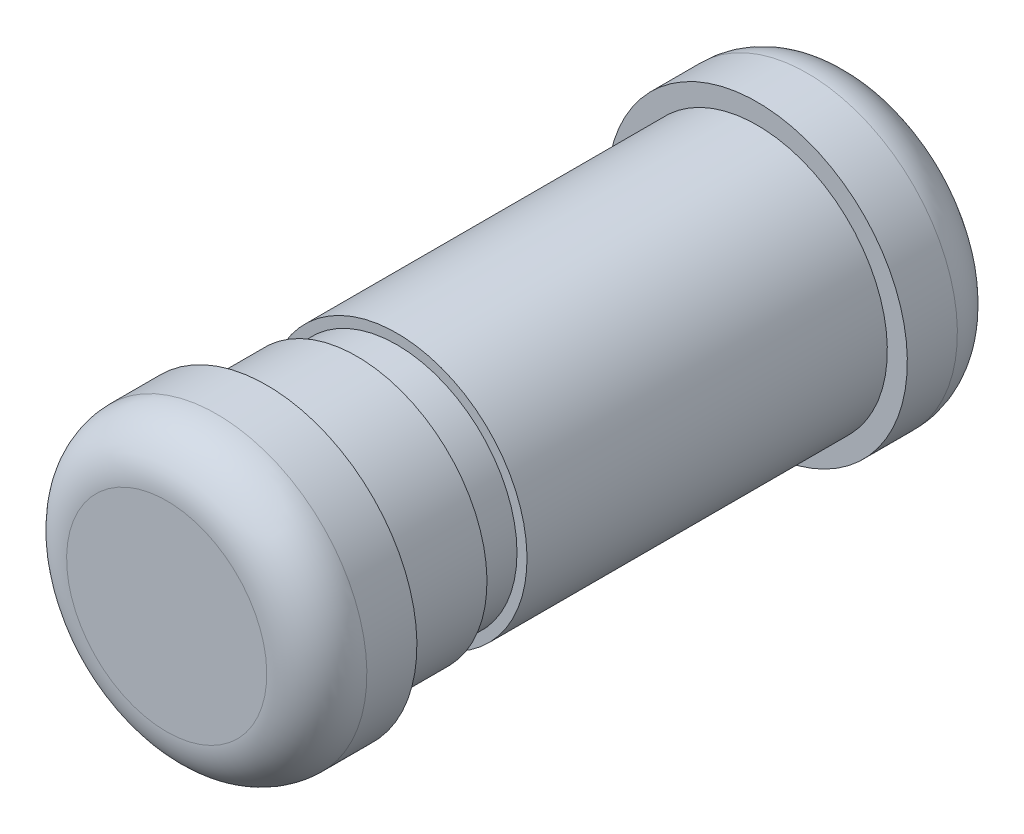
ISO-10303-21;
HEADER;
FILE_DESCRIPTION(('STEP AP214'),'2;1');
FILE_NAME('part.step','',(''),(''),'','','');
FILE_SCHEMA(('AUTOMOTIVE_DESIGN { 1 0 10303 214 1 1 1 1 }'));
ENDSEC;
DATA;
#1=APPLICATION_CONTEXT('core data for automotive mechanical design processes');
#2=APPLICATION_PROTOCOL_DEFINITION('international standard','automotive_design',2000,#1);
#3=PRODUCT_CONTEXT('',#1,'mechanical');
#4=PRODUCT('Part','Part','',(#3));
#5=PRODUCT_RELATED_PRODUCT_CATEGORY('part','',(#4));
#6=PRODUCT_DEFINITION_FORMATION('','',#4);
#7=PRODUCT_DEFINITION_CONTEXT('part definition',#1,'design');
#8=PRODUCT_DEFINITION('design','',#6,#7);
#9=PRODUCT_DEFINITION_SHAPE('','',#8);
#10=(LENGTH_UNIT() NAMED_UNIT(*) SI_UNIT(.MILLI.,.METRE.));
#11=(NAMED_UNIT(*) PLANE_ANGLE_UNIT() SI_UNIT($,.RADIAN.));
#12=(NAMED_UNIT(*) SI_UNIT($,.STERADIAN.) SOLID_ANGLE_UNIT());
#13=UNCERTAINTY_MEASURE_WITH_UNIT(LENGTH_MEASURE(1.E-05),#10,'distance_accuracy_value','');
#14=(GEOMETRIC_REPRESENTATION_CONTEXT(3) GLOBAL_UNCERTAINTY_ASSIGNED_CONTEXT((#13)) GLOBAL_UNIT_ASSIGNED_CONTEXT((#10,
#11,#12)) REPRESENTATION_CONTEXT('',''));
#15=CARTESIAN_POINT('',(0.,0.,0.));
#16=DIRECTION('',(0.,0.,1.));
#17=DIRECTION('',(1.,0.,0.));
#18=AXIS2_PLACEMENT_3D('',#15,#16,#17);
#19=CARTESIAN_POINT('',(0.,-0.499999999999998,-1.725));
#20=DIRECTION('',(0.,0.,-1.));
#21=DIRECTION('',(0.,1.,0.));
#22=AXIS2_PLACEMENT_3D('',#19,#20,#21);
#23=PLANE('',#22);
#24=CARTESIAN_POINT('',(0.,0.,-1.725));
#25=DIRECTION('',(0.,0.,1.));
#26=DIRECTION('',(0.,-1.,0.));
#27=AXIS2_PLACEMENT_3D('',#24,#25,#26);
#28=CIRCLE('',#27,0.499999999999999);
#29=CARTESIAN_POINT('',(0.,-0.499999999999998,-1.725));
#30=VERTEX_POINT('',#29);
#31=EDGE_CURVE('E10',#30,#30,#28,.T.);
#32=ORIENTED_EDGE('',*,*,#31,.F.);
#33=EDGE_LOOP('',(#32));
#34=FACE_BOUND('',#33,.T.);
#35=ADVANCED_FACE('F41',(#34),#23,.T.);
#36=CARTESIAN_POINT('',(0.,0.,-1.475));
#37=DIRECTION('',(0.,0.,1.));
#38=DIRECTION('',(0.,-1.,0.));
#39=AXIS2_PLACEMENT_3D('',#36,#37,#38);
#40=TOROIDAL_SURFACE('',#39,0.500000000000001,0.25);
#41=ORIENTED_EDGE('',*,*,#31,.T.);
#42=EDGE_LOOP('',(#41));
#43=FACE_BOUND('',#42,.T.);
#44=CARTESIAN_POINT('',(0.,0.,-1.475));
#45=DIRECTION('',(0.,0.,1.));
#46=DIRECTION('',(0.,-1.,0.));
#47=AXIS2_PLACEMENT_3D('',#44,#45,#46);
#48=CIRCLE('',#47,0.750000000000001);
#49=CARTESIAN_POINT('',(0.,-0.75,-1.475));
#50=VERTEX_POINT('',#49);
#51=EDGE_CURVE('E48',#50,#50,#48,.T.);
#52=ORIENTED_EDGE('',*,*,#51,.F.);
#53=EDGE_LOOP('',(#52));
#54=FACE_BOUND('',#53,.T.);
#55=ADVANCED_FACE('F113',(#43,#54),#40,.T.);
#56=CARTESIAN_POINT('',(0.,0.,1.725));
#57=DIRECTION('',(0.,0.,1.));
#58=DIRECTION('',(0.,-1.,0.));
#59=AXIS2_PLACEMENT_3D('',#56,#57,#58);
#60=CYLINDRICAL_SURFACE('',#59,0.750000000000001);
#61=ORIENTED_EDGE('',*,*,#51,.T.);
#62=EDGE_LOOP('',(#61));
#63=FACE_BOUND('',#62,.T.);
#64=CARTESIAN_POINT('',(0.,0.,-1.225));
#65=DIRECTION('',(0.,0.,1.));
#66=DIRECTION('',(0.,-1.,0.));
#67=AXIS2_PLACEMENT_3D('',#64,#65,#66);
#68=CIRCLE('',#67,0.750000000000001);
#69=CARTESIAN_POINT('',(0.,-0.75,-1.225));
#70=VERTEX_POINT('',#69);
#71=EDGE_CURVE('E54',#70,#70,#68,.T.);
#72=ORIENTED_EDGE('',*,*,#71,.F.);
#73=EDGE_LOOP('',(#72));
#74=FACE_BOUND('',#73,.T.);
#75=ADVANCED_FACE('F118',(#63,#74),#60,.T.);
#76=CARTESIAN_POINT('',(0.,-0.75,-1.225));
#77=DIRECTION('',(0.,0.,1.));
#78=DIRECTION('',(0.,-1.,0.));
#79=AXIS2_PLACEMENT_3D('',#76,#77,#78);
#80=PLANE('',#79);
#81=ORIENTED_EDGE('',*,*,#71,.T.);
#82=EDGE_LOOP('',(#81));
#83=FACE_BOUND('',#82,.T.);
#84=CARTESIAN_POINT('',(0.,0.,-1.225));
#85=DIRECTION('',(0.,0.,1.));
#86=DIRECTION('',(0.,-1.,0.));
#87=AXIS2_PLACEMENT_3D('',#84,#85,#86);
#88=CIRCLE('',#87,0.65);
#89=CARTESIAN_POINT('',(0.,-0.65,-1.225));
#90=VERTEX_POINT('',#89);
#91=EDGE_CURVE('E60',#90,#90,#88,.T.);
#92=ORIENTED_EDGE('',*,*,#91,.F.);
#93=EDGE_LOOP('',(#92));
#94=FACE_BOUND('',#93,.T.);
#95=ADVANCED_FACE('F122',(#83,#94),#80,.T.);
#96=CARTESIAN_POINT('',(0.,0.,1.725));
#97=DIRECTION('',(0.,0.,1.));
#98=DIRECTION('',(0.,-1.,0.));
#99=AXIS2_PLACEMENT_3D('',#96,#97,#98);
#100=CYLINDRICAL_SURFACE('',#99,0.65);
#101=ORIENTED_EDGE('',*,*,#91,.T.);
#102=EDGE_LOOP('',(#101));
#103=FACE_BOUND('',#102,.T.);
#104=CARTESIAN_POINT('',(0.,0.,0.575));
#105=DIRECTION('',(0.,0.,1.));
#106=DIRECTION('',(0.,-1.,0.));
#107=AXIS2_PLACEMENT_3D('',#104,#105,#106);
#108=CIRCLE('',#107,0.65);
#109=CARTESIAN_POINT('',(0.,-0.65,0.575));
#110=VERTEX_POINT('',#109);
#111=EDGE_CURVE('E66',#110,#110,#108,.T.);
#112=ORIENTED_EDGE('',*,*,#111,.F.);
#113=EDGE_LOOP('',(#112));
#114=FACE_BOUND('',#113,.T.);
#115=ADVANCED_FACE('F128',(#103,#114),#100,.T.);
#116=CARTESIAN_POINT('',(0.,-0.65,0.575));
#117=DIRECTION('',(0.,0.,1.));
#118=DIRECTION('',(0.,-1.,0.));
#119=AXIS2_PLACEMENT_3D('',#116,#117,#118);
#120=PLANE('',#119);
#121=ORIENTED_EDGE('',*,*,#111,.T.);
#122=EDGE_LOOP('',(#121));
#123=FACE_BOUND('',#122,.T.);
#124=CARTESIAN_POINT('',(0.,0.,0.575));
#125=DIRECTION('',(0.,0.,1.));
#126=DIRECTION('',(0.,-1.,0.));
#127=AXIS2_PLACEMENT_3D('',#124,#125,#126);
#128=CIRCLE('',#127,0.6);
#129=CARTESIAN_POINT('',(0.,-0.6,0.575));
#130=VERTEX_POINT('',#129);
#131=EDGE_CURVE('E70',#130,#130,#128,.T.);
#132=ORIENTED_EDGE('',*,*,#131,.F.);
#133=EDGE_LOOP('',(#132));
#134=FACE_BOUND('',#133,.T.);
#135=ADVANCED_FACE('F132',(#123,#134),#120,.T.);
#136=CARTESIAN_POINT('',(0.,0.,1.725));
#137=DIRECTION('',(0.,0.,1.));
#138=DIRECTION('',(0.,-1.,0.));
#139=AXIS2_PLACEMENT_3D('',#136,#137,#138);
#140=CYLINDRICAL_SURFACE('',#139,0.6);
#141=ORIENTED_EDGE('',*,*,#131,.T.);
#142=EDGE_LOOP('',(#141));
#143=FACE_BOUND('',#142,.T.);
#144=CARTESIAN_POINT('',(0.,0.,0.775));
#145=DIRECTION('',(0.,0.,1.));
#146=DIRECTION('',(0.,-1.,0.));
#147=AXIS2_PLACEMENT_3D('',#144,#145,#146);
#148=CIRCLE('',#147,0.6);
#149=CARTESIAN_POINT('',(0.,-0.6,0.775));
#150=VERTEX_POINT('',#149);
#151=EDGE_CURVE('E73',#150,#150,#148,.T.);
#152=ORIENTED_EDGE('',*,*,#151,.F.);
#153=EDGE_LOOP('',(#152));
#154=FACE_BOUND('',#153,.T.);
#155=ADVANCED_FACE('F136',(#143,#154),#140,.T.);
#156=CARTESIAN_POINT('',(0.,-0.6,0.775));
#157=DIRECTION('',(0.,0.,-1.));
#158=DIRECTION('',(0.,1.,0.));
#159=AXIS2_PLACEMENT_3D('',#156,#157,#158);
#160=PLANE('',#159);
#161=ORIENTED_EDGE('',*,*,#151,.T.);
#162=EDGE_LOOP('',(#161));
#163=FACE_BOUND('',#162,.T.);
#164=CARTESIAN_POINT('',(0.,0.,0.775));
#165=DIRECTION('',(0.,0.,1.));
#166=DIRECTION('',(0.,-1.,0.));
#167=AXIS2_PLACEMENT_3D('',#164,#165,#166);
#168=CIRCLE('',#167,0.65);
#169=CARTESIAN_POINT('',(0.,-0.65,0.775));
#170=VERTEX_POINT('',#169);
#171=EDGE_CURVE('E77',#170,#170,#168,.T.);
#172=ORIENTED_EDGE('',*,*,#171,.F.);
#173=EDGE_LOOP('',(#172));
#174=FACE_BOUND('',#173,.T.);
#175=ADVANCED_FACE('F140',(#163,#174),#160,.T.);
#176=CARTESIAN_POINT('',(0.,0.,1.725));
#177=DIRECTION('',(0.,0.,1.));
#178=DIRECTION('',(0.,-1.,0.));
#179=AXIS2_PLACEMENT_3D('',#176,#177,#178);
#180=CYLINDRICAL_SURFACE('',#179,0.65);
#181=ORIENTED_EDGE('',*,*,#171,.T.);
#182=EDGE_LOOP('',(#181));
#183=FACE_BOUND('',#182,.T.);
#184=CARTESIAN_POINT('',(0.,0.,1.225));
#185=DIRECTION('',(0.,0.,1.));
#186=DIRECTION('',(0.,-1.,0.));
#187=AXIS2_PLACEMENT_3D('',#184,#185,#186);
#188=CIRCLE('',#187,0.65);
#189=CARTESIAN_POINT('',(0.,-0.65,1.225));
#190=VERTEX_POINT('',#189);
#191=EDGE_CURVE('E81',#190,#190,#188,.T.);
#192=ORIENTED_EDGE('',*,*,#191,.F.);
#193=EDGE_LOOP('',(#192));
#194=FACE_BOUND('',#193,.T.);
#195=ADVANCED_FACE('F144',(#183,#194),#180,.T.);
#196=CARTESIAN_POINT('',(0.,-0.75,1.225));
#197=DIRECTION('',(0.,0.,-1.));
#198=DIRECTION('',(0.,1.,0.));
#199=AXIS2_PLACEMENT_3D('',#196,#197,#198);
#200=PLANE('',#199);
#201=ORIENTED_EDGE('',*,*,#191,.T.);
#202=EDGE_LOOP('',(#201));
#203=FACE_BOUND('',#202,.T.);
#204=CARTESIAN_POINT('',(0.,0.,1.225));
#205=DIRECTION('',(0.,0.,1.));
#206=DIRECTION('',(0.,-1.,0.));
#207=AXIS2_PLACEMENT_3D('',#204,#205,#206);
#208=CIRCLE('',#207,0.75);
#209=CARTESIAN_POINT('',(0.,-0.75,1.225));
#210=VERTEX_POINT('',#209);
#211=EDGE_CURVE('E84',#210,#210,#208,.T.);
#212=ORIENTED_EDGE('',*,*,#211,.F.);
#213=EDGE_LOOP('',(#212));
#214=FACE_BOUND('',#213,.T.);
#215=ADVANCED_FACE('F109',(#203,#214),#200,.T.);
#216=CARTESIAN_POINT('',(0.,0.,1.725));
#217=DIRECTION('',(0.,0.,1.));
#218=DIRECTION('',(0.,-1.,0.));
#219=AXIS2_PLACEMENT_3D('',#216,#217,#218);
#220=CYLINDRICAL_SURFACE('',#219,0.75);
#221=ORIENTED_EDGE('',*,*,#211,.T.);
#222=EDGE_LOOP('',(#221));
#223=FACE_BOUND('',#222,.T.);
#224=CARTESIAN_POINT('',(0.,0.,1.475));
#225=DIRECTION('',(0.,0.,1.));
#226=DIRECTION('',(0.,-1.,0.));
#227=AXIS2_PLACEMENT_3D('',#224,#225,#226);
#228=CIRCLE('',#227,0.75);
#229=CARTESIAN_POINT('',(0.,-0.75,1.475));
#230=VERTEX_POINT('',#229);
#231=EDGE_CURVE('E88',#230,#230,#228,.T.);
#232=ORIENTED_EDGE('',*,*,#231,.F.);
#233=EDGE_LOOP('',(#232));
#234=FACE_BOUND('',#233,.T.);
#235=ADVANCED_FACE('F101',(#223,#234),#220,.T.);
#236=CARTESIAN_POINT('',(0.,0.,1.475));
#237=DIRECTION('',(0.,0.,1.));
#238=DIRECTION('',(0.,-1.,0.));
#239=AXIS2_PLACEMENT_3D('',#236,#237,#238);
#240=TOROIDAL_SURFACE('',#239,0.5,0.25);
#241=ORIENTED_EDGE('',*,*,#231,.T.);
#242=EDGE_LOOP('',(#241));
#243=FACE_BOUND('',#242,.T.);
#244=CARTESIAN_POINT('',(0.,0.,1.725));
#245=DIRECTION('',(0.,0.,1.));
#246=DIRECTION('',(0.,-1.,0.));
#247=AXIS2_PLACEMENT_3D('',#244,#245,#246);
#248=CIRCLE('',#247,0.499999999999998);
#249=CARTESIAN_POINT('',(0.,-0.499999999999998,1.725));
#250=VERTEX_POINT('',#249);
#251=EDGE_CURVE('E92',#250,#250,#248,.T.);
#252=ORIENTED_EDGE('',*,*,#251,.F.);
#253=EDGE_LOOP('',(#252));
#254=FACE_BOUND('',#253,.T.);
#255=ADVANCED_FACE('F99',(#243,#254),#240,.T.);
#256=CARTESIAN_POINT('',(0.,-0.499999999999998,1.725));
#257=DIRECTION('',(0.,0.,1.));
#258=DIRECTION('',(0.,-1.,0.));
#259=AXIS2_PLACEMENT_3D('',#256,#257,#258);
#260=PLANE('',#259);
#261=ORIENTED_EDGE('',*,*,#251,.T.);
#262=EDGE_LOOP('',(#261));
#263=FACE_BOUND('',#262,.T.);
#264=ADVANCED_FACE('F97',(#263),#260,.T.);
#265=CLOSED_SHELL('',(#35,#55,#75,#95,#115,#135,#155,#175,#195,#215,#235,#255,#264));
#266=MANIFOLD_SOLID_BREP('B2',#265);
#267=ADVANCED_BREP_SHAPE_REPRESENTATION('',(#18,#266),#14);
#268=SHAPE_DEFINITION_REPRESENTATION(#9,#267);
ENDSEC;
END-ISO-10303-21;
